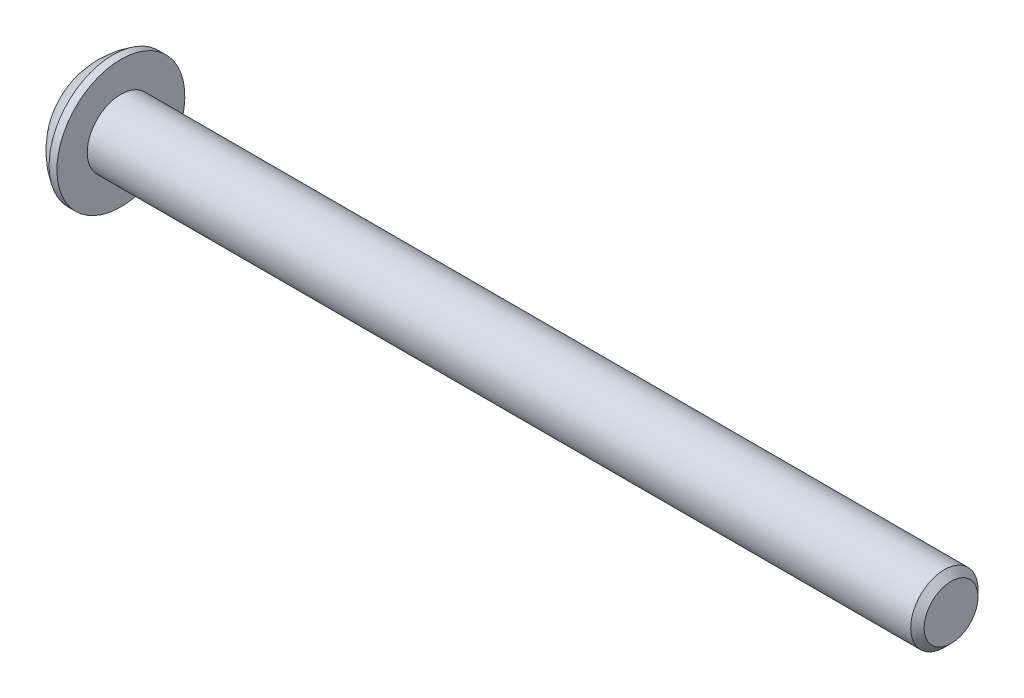
ISO-10303-21;
HEADER;
FILE_DESCRIPTION(('STEP AP214'),'2;1');
FILE_NAME('part.step','',(''),(''),'','','');
FILE_SCHEMA(('AUTOMOTIVE_DESIGN { 1 0 10303 214 1 1 1 1 }'));
ENDSEC;
DATA;
#1=APPLICATION_CONTEXT('core data for automotive mechanical design processes');
#2=APPLICATION_PROTOCOL_DEFINITION('international standard','automotive_design',2000,#1);
#3=PRODUCT_CONTEXT('',#1,'mechanical');
#4=PRODUCT('Part','Part','',(#3));
#5=PRODUCT_RELATED_PRODUCT_CATEGORY('part','',(#4));
#6=PRODUCT_DEFINITION_FORMATION('','',#4);
#7=PRODUCT_DEFINITION_CONTEXT('part definition',#1,'design');
#8=PRODUCT_DEFINITION('design','',#6,#7);
#9=PRODUCT_DEFINITION_SHAPE('','',#8);
#10=(LENGTH_UNIT() NAMED_UNIT(*) SI_UNIT(.MILLI.,.METRE.));
#11=(NAMED_UNIT(*) PLANE_ANGLE_UNIT() SI_UNIT($,.RADIAN.));
#12=(NAMED_UNIT(*) SI_UNIT($,.STERADIAN.) SOLID_ANGLE_UNIT());
#13=UNCERTAINTY_MEASURE_WITH_UNIT(LENGTH_MEASURE(1.E-05),#10,'distance_accuracy_value','');
#14=(GEOMETRIC_REPRESENTATION_CONTEXT(3) GLOBAL_UNCERTAINTY_ASSIGNED_CONTEXT((#13)) GLOBAL_UNIT_ASSIGNED_CONTEXT((#10,
#11,#12)) REPRESENTATION_CONTEXT('',''));
#15=CARTESIAN_POINT('',(0.,0.,0.));
#16=DIRECTION('',(0.,0.,1.));
#17=DIRECTION('',(1.,0.,0.));
#18=AXIS2_PLACEMENT_3D('',#15,#16,#17);
#19=CARTESIAN_POINT('',(38.65,1.5,0.));
#20=DIRECTION('',(1.,0.,0.));
#21=DIRECTION('',(0.,1.,0.));
#22=AXIS2_PLACEMENT_3D('',#19,#20,#21);
#23=PLANE('',#22);
#24=CARTESIAN_POINT('',(38.65,0.,0.));
#25=DIRECTION('',(1.,0.,0.));
#26=DIRECTION('',(0.,1.,0.));
#27=AXIS2_PLACEMENT_3D('',#24,#25,#26);
#28=CIRCLE('',#27,1.2);
#29=CARTESIAN_POINT('',(38.65,1.2,0.));
#30=VERTEX_POINT('',#29);
#31=EDGE_CURVE('E40',#30,#30,#28,.T.);
#32=ORIENTED_EDGE('',*,*,#31,.T.);
#33=EDGE_LOOP('',(#32));
#34=FACE_BOUND('',#33,.T.);
#35=ADVANCED_FACE('F32',(#34),#23,.T.);
#36=CARTESIAN_POINT('',(0.,0.,0.));
#37=DIRECTION('',(-1.,0.,0.));
#38=DIRECTION('',(0.,-1.,0.));
#39=AXIS2_PLACEMENT_3D('',#36,#37,#38);
#40=PLANE('',#39);
#41=DIRECTION('',(0.,0.999867428979849,0.0162826430663849));
#42=VECTOR('',#41,1.);
#43=CARTESIAN_POINT('',(0.,-0.593556372341841,0.990466640622353));
#44=LINE('',#43,#42);
#45=CARTESIAN_POINT('',(0.,-0.593556372341841,0.990466640622353));
#46=VERTEX_POINT('',#45);
#47=CARTESIAN_POINT('',(0.,0.56099108620907,1.00926821733734));
#48=VERTEX_POINT('',#47);
#49=EDGE_CURVE('E47',#46,#48,#44,.T.);
#50=ORIENTED_EDGE('',*,*,#49,.F.);
#51=DIRECTION('',(0.,0.48583253195368,0.874051915446375));
#52=VECTOR('',#51,1.);
#53=CARTESIAN_POINT('',(0.,-1.15454745855091,-0.0188015767149919));
#54=LINE('',#53,#52);
#55=CARTESIAN_POINT('',(0.,-1.15454745855091,-0.0188015767149919));
#56=VERTEX_POINT('',#55);
#57=EDGE_CURVE('E130',#56,#46,#54,.T.);
#58=ORIENTED_EDGE('',*,*,#57,.F.);
#59=DIRECTION('',(0.,-0.514034897026169,0.857769272379989));
#60=VECTOR('',#59,1.);
#61=CARTESIAN_POINT('',(0.,-0.560991086209069,-1.00926821733734));
#62=LINE('',#61,#60);
#63=CARTESIAN_POINT('',(0.,-0.560991086209069,-1.00926821733734));
#64=VERTEX_POINT('',#63);
#65=EDGE_CURVE('E128',#64,#56,#62,.T.);
#66=ORIENTED_EDGE('',*,*,#65,.F.);
#67=DIRECTION('',(0.,-0.999867428979849,-0.0162826430663849));
#68=VECTOR('',#67,1.);
#69=CARTESIAN_POINT('',(0.,0.59355637234184,-0.990466640622353));
#70=LINE('',#69,#68);
#71=CARTESIAN_POINT('',(0.,0.59355637234184,-0.990466640622353));
#72=VERTEX_POINT('',#71);
#73=EDGE_CURVE('E95',#72,#64,#70,.T.);
#74=ORIENTED_EDGE('',*,*,#73,.F.);
#75=DIRECTION('',(0.,-0.48583253195368,-0.874051915446375));
#76=VECTOR('',#75,1.);
#77=CARTESIAN_POINT('',(0.,1.15454745855091,0.0188015767149927));
#78=LINE('',#77,#76);
#79=CARTESIAN_POINT('',(0.,1.15454745855091,0.0188015767149927));
#80=VERTEX_POINT('',#79);
#81=EDGE_CURVE('E124',#80,#72,#78,.T.);
#82=ORIENTED_EDGE('',*,*,#81,.F.);
#83=DIRECTION('',(0.,0.514034897026169,-0.857769272379989));
#84=VECTOR('',#83,1.);
#85=CARTESIAN_POINT('',(0.,0.56099108620907,1.00926821733734));
#86=LINE('',#85,#84);
#87=EDGE_CURVE('E121',#48,#80,#86,.T.);
#88=ORIENTED_EDGE('',*,*,#87,.F.);
#89=EDGE_LOOP('',(#50,#58,#66,#74,#82,#88));
#90=FACE_BOUND('',#89,.T.);
#91=CARTESIAN_POINT('',(0.,0.,0.));
#92=DIRECTION('',(1.,0.,0.));
#93=DIRECTION('',(0.,1.,0.));
#94=AXIS2_PLACEMENT_3D('',#91,#92,#93);
#95=CIRCLE('',#94,1.425);
#96=CARTESIAN_POINT('',(0.,1.425,0.));
#97=VERTEX_POINT('',#96);
#98=EDGE_CURVE('E148',#97,#97,#95,.T.);
#99=ORIENTED_EDGE('',*,*,#98,.F.);
#100=EDGE_LOOP('',(#99));
#101=FACE_BOUND('',#100,.T.);
#102=ADVANCED_FACE('F163',(#90,#101),#40,.T.);
#103=CARTESIAN_POINT('',(3.02008573133697,0.,0.));
#104=DIRECTION('',(1.,0.,0.));
#105=DIRECTION('',(0.,1.,0.));
#106=AXIS2_PLACEMENT_3D('',#103,#104,#105);
#107=DEGENERATE_TOROIDAL_SURFACE('',#106,0.0246834742021577,3.35,.F.);
#108=ORIENTED_EDGE('',*,*,#98,.T.);
#109=EDGE_LOOP('',(#108));
#110=FACE_BOUND('',#109,.T.);
#111=CARTESIAN_POINT('',(1.3,0.,0.));
#112=DIRECTION('',(1.,0.,0.));
#113=DIRECTION('',(0.,1.,0.));
#114=AXIS2_PLACEMENT_3D('',#111,#112,#113);
#115=CIRCLE('',#114,2.84999999999999);
#116=CARTESIAN_POINT('',(1.3,2.84999999999999,0.));
#117=VERTEX_POINT('',#116);
#118=EDGE_CURVE('E145',#117,#117,#115,.T.);
#119=ORIENTED_EDGE('',*,*,#118,.F.);
#120=EDGE_LOOP('',(#119));
#121=FACE_BOUND('',#120,.T.);
#122=ADVANCED_FACE('F167',(#110,#121),#107,.F.);
#123=CARTESIAN_POINT('',(38.65,0.,0.));
#124=DIRECTION('',(1.,0.,0.));
#125=DIRECTION('',(0.,1.,0.));
#126=AXIS2_PLACEMENT_3D('',#123,#124,#125);
#127=CYLINDRICAL_SURFACE('',#126,2.84999999999999);
#128=ORIENTED_EDGE('',*,*,#118,.T.);
#129=EDGE_LOOP('',(#128));
#130=FACE_BOUND('',#129,.T.);
#131=CARTESIAN_POINT('',(1.65,0.,0.));
#132=DIRECTION('',(1.,0.,0.));
#133=DIRECTION('',(0.,1.,0.));
#134=AXIS2_PLACEMENT_3D('',#131,#132,#133);
#135=CIRCLE('',#134,2.85);
#136=CARTESIAN_POINT('',(1.65,2.85,0.));
#137=VERTEX_POINT('',#136);
#138=EDGE_CURVE('E142',#137,#137,#135,.T.);
#139=ORIENTED_EDGE('',*,*,#138,.F.);
#140=EDGE_LOOP('',(#139));
#141=FACE_BOUND('',#140,.T.);
#142=ADVANCED_FACE('F173',(#130,#141),#127,.T.);
#143=CARTESIAN_POINT('',(1.65,2.85,0.));
#144=DIRECTION('',(1.,0.,0.));
#145=DIRECTION('',(0.,1.,0.));
#146=AXIS2_PLACEMENT_3D('',#143,#144,#145);
#147=PLANE('',#146);
#148=ORIENTED_EDGE('',*,*,#138,.T.);
#149=EDGE_LOOP('',(#148));
#150=FACE_BOUND('',#149,.T.);
#151=CARTESIAN_POINT('',(1.65,0.,0.));
#152=DIRECTION('',(1.,0.,0.));
#153=DIRECTION('',(0.,1.,0.));
#154=AXIS2_PLACEMENT_3D('',#151,#152,#153);
#155=CIRCLE('',#154,1.5);
#156=CARTESIAN_POINT('',(1.65,1.5,0.));
#157=VERTEX_POINT('',#156);
#158=EDGE_CURVE('E134',#157,#157,#155,.T.);
#159=ORIENTED_EDGE('',*,*,#158,.F.);
#160=EDGE_LOOP('',(#159));
#161=FACE_BOUND('',#160,.T.);
#162=ADVANCED_FACE('F177',(#150,#161),#147,.T.);
#163=CARTESIAN_POINT('',(38.65,0.,0.));
#164=DIRECTION('',(1.,0.,0.));
#165=DIRECTION('',(0.,1.,0.));
#166=AXIS2_PLACEMENT_3D('',#163,#164,#165);
#167=CYLINDRICAL_SURFACE('',#166,1.5);
#168=CARTESIAN_POINT('',(38.35,0.,0.));
#169=DIRECTION('',(1.,0.,0.));
#170=DIRECTION('',(0.,1.,0.));
#171=AXIS2_PLACEMENT_3D('',#168,#169,#170);
#172=CIRCLE('',#171,1.5);
#173=CARTESIAN_POINT('',(38.35,1.5,0.));
#174=VERTEX_POINT('',#173);
#175=EDGE_CURVE('E11',#174,#174,#172,.F.);
#176=ORIENTED_EDGE('',*,*,#175,.T.);
#177=EDGE_LOOP('',(#176));
#178=FACE_BOUND('',#177,.T.);
#179=ORIENTED_EDGE('',*,*,#158,.T.);
#180=EDGE_LOOP('',(#179));
#181=FACE_BOUND('',#180,.T.);
#182=ADVANCED_FACE('F181',(#178,#181),#167,.T.);
#183=CARTESIAN_POINT('',(1.,-0.593556372341841,0.990466640622353));
#184=DIRECTION('',(0.,-0.0162826430663849,0.999867428979849));
#185=DIRECTION('',(0.,-0.999867428979849,-0.0162826430663849));
#186=AXIS2_PLACEMENT_3D('',#183,#184,#185);
#187=PLANE('',#186);
#188=ORIENTED_EDGE('',*,*,#49,.T.);
#189=DIRECTION('',(-1.,0.,0.));
#190=VECTOR('',#189,1.);
#191=CARTESIAN_POINT('',(1.,0.56099108620907,1.00926821733734));
#192=LINE('',#191,#190);
#193=CARTESIAN_POINT('',(1.,0.56099108620907,1.00926821733734));
#194=VERTEX_POINT('',#193);
#195=EDGE_CURVE('E77',#194,#48,#192,.T.);
#196=ORIENTED_EDGE('',*,*,#195,.F.);
#197=DIRECTION('',(0.,0.999867428979849,0.0162826430663849));
#198=VECTOR('',#197,1.);
#199=CARTESIAN_POINT('',(1.,-0.593556372341841,0.990466640622353));
#200=LINE('',#199,#198);
#201=CARTESIAN_POINT('',(1.,-0.593556372341841,0.990466640622353));
#202=VERTEX_POINT('',#201);
#203=EDGE_CURVE('E132',#202,#194,#200,.T.);
#204=ORIENTED_EDGE('',*,*,#203,.F.);
#205=DIRECTION('',(-1.,0.,0.));
#206=VECTOR('',#205,1.);
#207=CARTESIAN_POINT('',(1.,-0.593556372341841,0.990466640622353));
#208=LINE('',#207,#206);
#209=EDGE_CURVE('E55',#202,#46,#208,.T.);
#210=ORIENTED_EDGE('',*,*,#209,.T.);
#211=EDGE_LOOP('',(#188,#196,#204,#210));
#212=FACE_BOUND('',#211,.T.);
#213=ADVANCED_FACE('F185',(#212),#187,.F.);
#214=CARTESIAN_POINT('',(1.,-1.15454745855091,-0.0188015767149919));
#215=DIRECTION('',(0.,-0.874051915446375,0.48583253195368));
#216=DIRECTION('',(0.,-0.48583253195368,-0.874051915446375));
#217=AXIS2_PLACEMENT_3D('',#214,#215,#216);
#218=PLANE('',#217);
#219=ORIENTED_EDGE('',*,*,#57,.T.);
#220=ORIENTED_EDGE('',*,*,#209,.F.);
#221=DIRECTION('',(0.,0.48583253195368,0.874051915446375));
#222=VECTOR('',#221,1.);
#223=CARTESIAN_POINT('',(1.,-1.15454745855091,-0.0188015767149919));
#224=LINE('',#223,#222);
#225=CARTESIAN_POINT('',(1.,-1.15454745855091,-0.0188015767149919));
#226=VERTEX_POINT('',#225);
#227=EDGE_CURVE('E107',#226,#202,#224,.T.);
#228=ORIENTED_EDGE('',*,*,#227,.F.);
#229=DIRECTION('',(-1.,0.,0.));
#230=VECTOR('',#229,1.);
#231=CARTESIAN_POINT('',(1.,-1.15454745855091,-0.0188015767149919));
#232=LINE('',#231,#230);
#233=EDGE_CURVE('E99',#226,#56,#232,.T.);
#234=ORIENTED_EDGE('',*,*,#233,.T.);
#235=EDGE_LOOP('',(#219,#220,#228,#234));
#236=FACE_BOUND('',#235,.T.);
#237=ADVANCED_FACE('F189',(#236),#218,.F.);
#238=CARTESIAN_POINT('',(1.,-0.560991086209069,-1.00926821733734));
#239=DIRECTION('',(0.,-0.857769272379989,-0.514034897026169));
#240=DIRECTION('',(0.,0.514034897026169,-0.857769272379989));
#241=AXIS2_PLACEMENT_3D('',#238,#239,#240);
#242=PLANE('',#241);
#243=ORIENTED_EDGE('',*,*,#65,.T.);
#244=ORIENTED_EDGE('',*,*,#233,.F.);
#245=DIRECTION('',(0.,-0.514034897026169,0.857769272379989));
#246=VECTOR('',#245,1.);
#247=CARTESIAN_POINT('',(1.,-0.560991086209069,-1.00926821733734));
#248=LINE('',#247,#246);
#249=CARTESIAN_POINT('',(1.,-0.560991086209069,-1.00926821733734));
#250=VERTEX_POINT('',#249);
#251=EDGE_CURVE('E103',#250,#226,#248,.T.);
#252=ORIENTED_EDGE('',*,*,#251,.F.);
#253=DIRECTION('',(-1.,0.,0.));
#254=VECTOR('',#253,1.);
#255=CARTESIAN_POINT('',(1.,-0.560991086209069,-1.00926821733734));
#256=LINE('',#255,#254);
#257=EDGE_CURVE('E88',#250,#64,#256,.T.);
#258=ORIENTED_EDGE('',*,*,#257,.T.);
#259=EDGE_LOOP('',(#243,#244,#252,#258));
#260=FACE_BOUND('',#259,.T.);
#261=ADVANCED_FACE('F104',(#260),#242,.F.);
#262=CARTESIAN_POINT('',(1.,0.59355637234184,-0.990466640622353));
#263=DIRECTION('',(0.,0.0162826430663849,-0.999867428979849));
#264=DIRECTION('',(0.,0.999867428979849,0.0162826430663849));
#265=AXIS2_PLACEMENT_3D('',#262,#263,#264);
#266=PLANE('',#265);
#267=ORIENTED_EDGE('',*,*,#73,.T.);
#268=ORIENTED_EDGE('',*,*,#257,.F.);
#269=DIRECTION('',(0.,-0.999867428979849,-0.0162826430663849));
#270=VECTOR('',#269,1.);
#271=CARTESIAN_POINT('',(1.,0.59355637234184,-0.990466640622353));
#272=LINE('',#271,#270);
#273=CARTESIAN_POINT('',(1.,0.59355637234184,-0.990466640622353));
#274=VERTEX_POINT('',#273);
#275=EDGE_CURVE('E92',#274,#250,#272,.T.);
#276=ORIENTED_EDGE('',*,*,#275,.F.);
#277=DIRECTION('',(-1.,0.,0.));
#278=VECTOR('',#277,1.);
#279=CARTESIAN_POINT('',(1.,0.59355637234184,-0.990466640622353));
#280=LINE('',#279,#278);
#281=EDGE_CURVE('E100',#274,#72,#280,.T.);
#282=ORIENTED_EDGE('',*,*,#281,.T.);
#283=EDGE_LOOP('',(#267,#268,#276,#282));
#284=FACE_BOUND('',#283,.T.);
#285=ADVANCED_FACE('F90',(#284),#266,.F.);
#286=CARTESIAN_POINT('',(1.,1.15454745855091,0.0188015767149927));
#287=DIRECTION('',(0.,0.874051915446375,-0.48583253195368));
#288=DIRECTION('',(0.,0.48583253195368,0.874051915446375));
#289=AXIS2_PLACEMENT_3D('',#286,#287,#288);
#290=PLANE('',#289);
#291=ORIENTED_EDGE('',*,*,#81,.T.);
#292=ORIENTED_EDGE('',*,*,#281,.F.);
#293=DIRECTION('',(0.,-0.48583253195368,-0.874051915446375));
#294=VECTOR('',#293,1.);
#295=CARTESIAN_POINT('',(1.,1.15454745855091,0.0188015767149927));
#296=LINE('',#295,#294);
#297=CARTESIAN_POINT('',(1.,1.15454745855091,0.0188015767149927));
#298=VERTEX_POINT('',#297);
#299=EDGE_CURVE('E113',#298,#274,#296,.T.);
#300=ORIENTED_EDGE('',*,*,#299,.F.);
#301=DIRECTION('',(-1.,0.,0.));
#302=VECTOR('',#301,1.);
#303=CARTESIAN_POINT('',(1.,1.15454745855091,0.0188015767149927));
#304=LINE('',#303,#302);
#305=EDGE_CURVE('E137',#298,#80,#304,.T.);
#306=ORIENTED_EDGE('',*,*,#305,.T.);
#307=EDGE_LOOP('',(#291,#292,#300,#306));
#308=FACE_BOUND('',#307,.T.);
#309=ADVANCED_FACE('F192',(#308),#290,.F.);
#310=CARTESIAN_POINT('',(1.,0.56099108620907,1.00926821733734));
#311=DIRECTION('',(0.,0.857769272379989,0.514034897026169));
#312=DIRECTION('',(0.,-0.514034897026169,0.857769272379989));
#313=AXIS2_PLACEMENT_3D('',#310,#311,#312);
#314=PLANE('',#313);
#315=ORIENTED_EDGE('',*,*,#87,.T.);
#316=ORIENTED_EDGE('',*,*,#305,.F.);
#317=DIRECTION('',(0.,0.514034897026169,-0.857769272379989));
#318=VECTOR('',#317,1.);
#319=CARTESIAN_POINT('',(1.,0.56099108620907,1.00926821733734));
#320=LINE('',#319,#318);
#321=EDGE_CURVE('E115',#194,#298,#320,.T.);
#322=ORIENTED_EDGE('',*,*,#321,.F.);
#323=ORIENTED_EDGE('',*,*,#195,.T.);
#324=EDGE_LOOP('',(#315,#316,#322,#323));
#325=FACE_BOUND('',#324,.T.);
#326=ADVANCED_FACE('F159',(#325),#314,.F.);
#327=CARTESIAN_POINT('',(1.,0.,0.));
#328=DIRECTION('',(-1.,0.,0.));
#329=DIRECTION('',(0.,-1.,0.));
#330=AXIS2_PLACEMENT_3D('',#327,#328,#329);
#331=PLANE('',#330);
#332=ORIENTED_EDGE('',*,*,#203,.T.);
#333=ORIENTED_EDGE('',*,*,#321,.T.);
#334=ORIENTED_EDGE('',*,*,#299,.T.);
#335=ORIENTED_EDGE('',*,*,#275,.T.);
#336=ORIENTED_EDGE('',*,*,#251,.T.);
#337=ORIENTED_EDGE('',*,*,#227,.T.);
#338=EDGE_LOOP('',(#332,#333,#334,#335,#336,#337));
#339=FACE_BOUND('',#338,.T.);
#340=ADVANCED_FACE('F110',(#339),#331,.T.);
#341=CARTESIAN_POINT('',(38.65,0.,0.));
#342=DIRECTION('',(-1.,0.,0.));
#343=DIRECTION('',(0.,-1.,0.));
#344=AXIS2_PLACEMENT_3D('',#341,#342,#343);
#345=CONICAL_SURFACE('',#344,1.2,0.785398163397435);
#346=ORIENTED_EDGE('',*,*,#175,.F.);
#347=EDGE_LOOP('',(#346));
#348=FACE_BOUND('',#347,.T.);
#349=ORIENTED_EDGE('',*,*,#31,.F.);
#350=EDGE_LOOP('',(#349));
#351=FACE_BOUND('',#350,.T.);
#352=ADVANCED_FACE('F34',(#348,#351),#345,.T.);
#353=CLOSED_SHELL('',(#35,#102,#122,#142,#162,#182,#213,#237,#261,#285,#309,#326,#340,#352));
#354=MANIFOLD_SOLID_BREP('B2',#353);
#355=ADVANCED_BREP_SHAPE_REPRESENTATION('',(#18,#354),#14);
#356=SHAPE_DEFINITION_REPRESENTATION(#9,#355);
ENDSEC;
END-ISO-10303-21;
